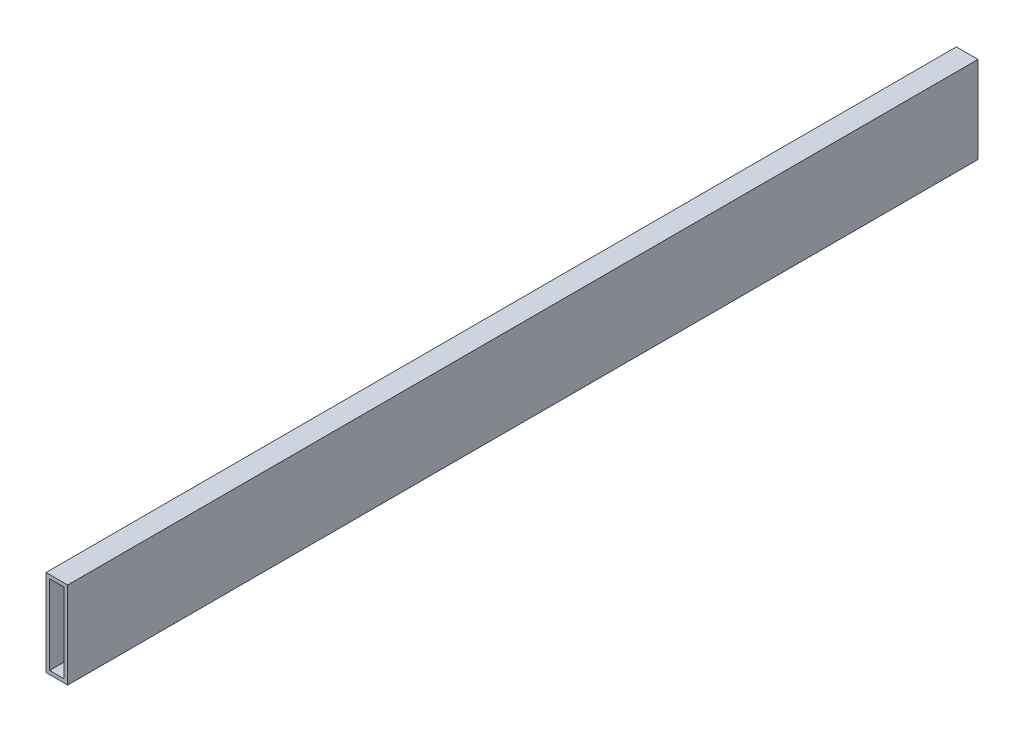
ISO-10303-21;
HEADER;
FILE_DESCRIPTION(('STEP AP214'),'2;1');
FILE_NAME('part.step','',(''),(''),'','','');
FILE_SCHEMA(('AUTOMOTIVE_DESIGN { 1 0 10303 214 1 1 1 1 }'));
ENDSEC;
DATA;
#1=APPLICATION_CONTEXT('core data for automotive mechanical design processes');
#2=APPLICATION_PROTOCOL_DEFINITION('international standard','automotive_design',2000,#1);
#3=PRODUCT_CONTEXT('',#1,'mechanical');
#4=PRODUCT('Part','Part','',(#3));
#5=PRODUCT_RELATED_PRODUCT_CATEGORY('part','',(#4));
#6=PRODUCT_DEFINITION_FORMATION('','',#4);
#7=PRODUCT_DEFINITION_CONTEXT('part definition',#1,'design');
#8=PRODUCT_DEFINITION('design','',#6,#7);
#9=PRODUCT_DEFINITION_SHAPE('','',#8);
#10=(LENGTH_UNIT() NAMED_UNIT(*) SI_UNIT(.MILLI.,.METRE.));
#11=(NAMED_UNIT(*) PLANE_ANGLE_UNIT() SI_UNIT($,.RADIAN.));
#12=(NAMED_UNIT(*) SI_UNIT($,.STERADIAN.) SOLID_ANGLE_UNIT());
#13=UNCERTAINTY_MEASURE_WITH_UNIT(LENGTH_MEASURE(1.E-05),#10,'distance_accuracy_value','');
#14=(GEOMETRIC_REPRESENTATION_CONTEXT(3) GLOBAL_UNCERTAINTY_ASSIGNED_CONTEXT((#13)) GLOBAL_UNIT_ASSIGNED_CONTEXT((#10,
#11,#12)) REPRESENTATION_CONTEXT('',''));
#15=CARTESIAN_POINT('',(0.,0.,0.));
#16=DIRECTION('',(0.,0.,1.));
#17=DIRECTION('',(1.,0.,0.));
#18=AXIS2_PLACEMENT_3D('',#15,#16,#17);
#19=CARTESIAN_POINT('',(0.,0.,800.1));
#20=DIRECTION('',(0.,0.,1.));
#21=DIRECTION('',(1.,0.,0.));
#22=AXIS2_PLACEMENT_3D('',#19,#20,#21);
#23=PLANE('',#22);
#24=DIRECTION('',(0.,1.,0.));
#25=VECTOR('',#24,1.);
#26=CARTESIAN_POINT('',(9.525,-38.1,800.1));
#27=LINE('',#26,#25);
#28=CARTESIAN_POINT('',(9.525,-38.1,800.1));
#29=VERTEX_POINT('',#28);
#30=CARTESIAN_POINT('',(9.525,38.1,800.1));
#31=VERTEX_POINT('',#30);
#32=EDGE_CURVE('E181',#29,#31,#27,.T.);
#33=ORIENTED_EDGE('',*,*,#32,.T.);
#34=DIRECTION('',(-1.,0.,0.));
#35=VECTOR('',#34,1.);
#36=CARTESIAN_POINT('',(-9.525,38.1,800.1));
#37=LINE('',#36,#35);
#38=CARTESIAN_POINT('',(-9.525,38.1,800.1));
#39=VERTEX_POINT('',#38);
#40=EDGE_CURVE('E185',#31,#39,#37,.T.);
#41=ORIENTED_EDGE('',*,*,#40,.T.);
#42=DIRECTION('',(0.,-1.,0.));
#43=VECTOR('',#42,1.);
#44=CARTESIAN_POINT('',(-9.525,-38.1,800.1));
#45=LINE('',#44,#43);
#46=CARTESIAN_POINT('',(-9.525,-38.1,800.1));
#47=VERTEX_POINT('',#46);
#48=EDGE_CURVE('E188',#39,#47,#45,.T.);
#49=ORIENTED_EDGE('',*,*,#48,.T.);
#50=DIRECTION('',(1.,0.,0.));
#51=VECTOR('',#50,1.);
#52=CARTESIAN_POINT('',(-9.525,-38.1,800.1));
#53=LINE('',#52,#51);
#54=EDGE_CURVE('E191',#47,#29,#53,.T.);
#55=ORIENTED_EDGE('',*,*,#54,.T.);
#56=EDGE_LOOP('',(#33,#41,#49,#55));
#57=FACE_BOUND('',#56,.T.);
#58=DIRECTION('',(-1.,0.,0.));
#59=VECTOR('',#58,1.);
#60=CARTESIAN_POINT('',(0.,34.925,800.1));
#61=LINE('',#60,#59);
#62=CARTESIAN_POINT('',(6.35,34.925,800.1));
#63=VERTEX_POINT('',#62);
#64=CARTESIAN_POINT('',(-6.35,34.925,800.1));
#65=VERTEX_POINT('',#64);
#66=EDGE_CURVE('E144',#63,#65,#61,.T.);
#67=ORIENTED_EDGE('',*,*,#66,.F.);
#68=DIRECTION('',(0.,1.,0.));
#69=VECTOR('',#68,1.);
#70=CARTESIAN_POINT('',(6.35,0.,800.1));
#71=LINE('',#70,#69);
#72=CARTESIAN_POINT('',(6.35,-34.925,800.1));
#73=VERTEX_POINT('',#72);
#74=EDGE_CURVE('E135',#73,#63,#71,.T.);
#75=ORIENTED_EDGE('',*,*,#74,.F.);
#76=DIRECTION('',(1.,0.,0.));
#77=VECTOR('',#76,1.);
#78=CARTESIAN_POINT('',(0.,-34.925,800.1));
#79=LINE('',#78,#77);
#80=CARTESIAN_POINT('',(-6.35,-34.925,800.1));
#81=VERTEX_POINT('',#80);
#82=EDGE_CURVE('E162',#81,#73,#79,.T.);
#83=ORIENTED_EDGE('',*,*,#82,.F.);
#84=DIRECTION('',(0.,-1.,0.));
#85=VECTOR('',#84,1.);
#86=CARTESIAN_POINT('',(-6.35,0.,800.1));
#87=LINE('',#86,#85);
#88=EDGE_CURVE('E157',#65,#81,#87,.T.);
#89=ORIENTED_EDGE('',*,*,#88,.F.);
#90=EDGE_LOOP('',(#67,#75,#83,#89));
#91=FACE_BOUND('',#90,.T.);
#92=ADVANCED_FACE('F63',(#57,#91),#23,.T.);
#93=CARTESIAN_POINT('',(0.,0.,0.));
#94=DIRECTION('',(0.,0.,1.));
#95=DIRECTION('',(1.,0.,0.));
#96=AXIS2_PLACEMENT_3D('',#93,#94,#95);
#97=PLANE('',#96);
#98=DIRECTION('',(0.,1.,0.));
#99=VECTOR('',#98,1.);
#100=CARTESIAN_POINT('',(9.525,-38.1,0.));
#101=LINE('',#100,#99);
#102=CARTESIAN_POINT('',(9.525,-38.1,0.));
#103=VERTEX_POINT('',#102);
#104=CARTESIAN_POINT('',(9.525,38.1,0.));
#105=VERTEX_POINT('',#104);
#106=EDGE_CURVE('E153',#103,#105,#101,.T.);
#107=ORIENTED_EDGE('',*,*,#106,.F.);
#108=DIRECTION('',(1.,0.,0.));
#109=VECTOR('',#108,1.);
#110=CARTESIAN_POINT('',(-9.525,-38.1,0.));
#111=LINE('',#110,#109);
#112=CARTESIAN_POINT('',(-9.525,-38.1,0.));
#113=VERTEX_POINT('',#112);
#114=EDGE_CURVE('E186',#113,#103,#111,.T.);
#115=ORIENTED_EDGE('',*,*,#114,.F.);
#116=DIRECTION('',(0.,-1.,0.));
#117=VECTOR('',#116,1.);
#118=CARTESIAN_POINT('',(-9.525,-38.1,0.));
#119=LINE('',#118,#117);
#120=CARTESIAN_POINT('',(-9.525,38.1,0.));
#121=VERTEX_POINT('',#120);
#122=EDGE_CURVE('E199',#121,#113,#119,.T.);
#123=ORIENTED_EDGE('',*,*,#122,.F.);
#124=DIRECTION('',(-1.,0.,0.));
#125=VECTOR('',#124,1.);
#126=CARTESIAN_POINT('',(-9.525,38.1,0.));
#127=LINE('',#126,#125);
#128=EDGE_CURVE('E197',#105,#121,#127,.T.);
#129=ORIENTED_EDGE('',*,*,#128,.F.);
#130=EDGE_LOOP('',(#107,#115,#123,#129));
#131=FACE_BOUND('',#130,.T.);
#132=DIRECTION('',(0.,1.,0.));
#133=VECTOR('',#132,1.);
#134=CARTESIAN_POINT('',(6.35,0.,0.));
#135=LINE('',#134,#133);
#136=CARTESIAN_POINT('',(6.35,-34.925,0.));
#137=VERTEX_POINT('',#136);
#138=CARTESIAN_POINT('',(6.35,34.925,0.));
#139=VERTEX_POINT('',#138);
#140=EDGE_CURVE('E90',#137,#139,#135,.T.);
#141=ORIENTED_EDGE('',*,*,#140,.T.);
#142=DIRECTION('',(-1.,0.,0.));
#143=VECTOR('',#142,1.);
#144=CARTESIAN_POINT('',(0.,34.925,0.));
#145=LINE('',#144,#143);
#146=CARTESIAN_POINT('',(-6.35,34.925,0.));
#147=VERTEX_POINT('',#146);
#148=EDGE_CURVE('E151',#139,#147,#145,.T.);
#149=ORIENTED_EDGE('',*,*,#148,.T.);
#150=DIRECTION('',(0.,-1.,0.));
#151=VECTOR('',#150,1.);
#152=CARTESIAN_POINT('',(-6.35,0.,0.));
#153=LINE('',#152,#151);
#154=CARTESIAN_POINT('',(-6.35,-34.925,0.));
#155=VERTEX_POINT('',#154);
#156=EDGE_CURVE('E169',#147,#155,#153,.T.);
#157=ORIENTED_EDGE('',*,*,#156,.T.);
#158=DIRECTION('',(1.,0.,0.));
#159=VECTOR('',#158,1.);
#160=CARTESIAN_POINT('',(0.,-34.925,0.));
#161=LINE('',#160,#159);
#162=EDGE_CURVE('E145',#155,#137,#161,.T.);
#163=ORIENTED_EDGE('',*,*,#162,.T.);
#164=EDGE_LOOP('',(#141,#149,#157,#163));
#165=FACE_BOUND('',#164,.T.);
#166=ADVANCED_FACE('F221',(#131,#165),#97,.F.);
#167=CARTESIAN_POINT('',(9.525,-38.1,800.1));
#168=DIRECTION('',(-1.,0.,0.));
#169=DIRECTION('',(0.,0.,1.));
#170=AXIS2_PLACEMENT_3D('',#167,#168,#169);
#171=PLANE('',#170);
#172=ORIENTED_EDGE('',*,*,#106,.T.);
#173=DIRECTION('',(0.,0.,-1.));
#174=VECTOR('',#173,1.);
#175=CARTESIAN_POINT('',(9.525,38.1,800.1));
#176=LINE('',#175,#174);
#177=EDGE_CURVE('E12',#31,#105,#176,.T.);
#178=ORIENTED_EDGE('',*,*,#177,.F.);
#179=ORIENTED_EDGE('',*,*,#32,.F.);
#180=DIRECTION('',(0.,0.,-1.));
#181=VECTOR('',#180,1.);
#182=CARTESIAN_POINT('',(9.525,-38.1,800.1));
#183=LINE('',#182,#181);
#184=EDGE_CURVE('E193',#29,#103,#183,.T.);
#185=ORIENTED_EDGE('',*,*,#184,.T.);
#186=EDGE_LOOP('',(#172,#178,#179,#185));
#187=FACE_BOUND('',#186,.T.);
#188=ADVANCED_FACE('F65',(#187),#171,.F.);
#189=CARTESIAN_POINT('',(-9.525,38.1,800.1));
#190=DIRECTION('',(0.,-1.,0.));
#191=DIRECTION('',(0.,0.,-1.));
#192=AXIS2_PLACEMENT_3D('',#189,#190,#191);
#193=PLANE('',#192);
#194=ORIENTED_EDGE('',*,*,#128,.T.);
#195=DIRECTION('',(0.,0.,-1.));
#196=VECTOR('',#195,1.);
#197=CARTESIAN_POINT('',(-9.525,38.1,800.1));
#198=LINE('',#197,#196);
#199=EDGE_CURVE('E72',#39,#121,#198,.T.);
#200=ORIENTED_EDGE('',*,*,#199,.F.);
#201=ORIENTED_EDGE('',*,*,#40,.F.);
#202=ORIENTED_EDGE('',*,*,#177,.T.);
#203=EDGE_LOOP('',(#194,#200,#201,#202));
#204=FACE_BOUND('',#203,.T.);
#205=ADVANCED_FACE('F231',(#204),#193,.F.);
#206=CARTESIAN_POINT('',(-9.525,-38.1,800.1));
#207=DIRECTION('',(1.,0.,0.));
#208=DIRECTION('',(0.,0.,-1.));
#209=AXIS2_PLACEMENT_3D('',#206,#207,#208);
#210=PLANE('',#209);
#211=ORIENTED_EDGE('',*,*,#122,.T.);
#212=DIRECTION('',(0.,0.,-1.));
#213=VECTOR('',#212,1.);
#214=CARTESIAN_POINT('',(-9.525,-38.1,800.1));
#215=LINE('',#214,#213);
#216=EDGE_CURVE('E206',#47,#113,#215,.T.);
#217=ORIENTED_EDGE('',*,*,#216,.F.);
#218=ORIENTED_EDGE('',*,*,#48,.F.);
#219=ORIENTED_EDGE('',*,*,#199,.T.);
#220=EDGE_LOOP('',(#211,#217,#218,#219));
#221=FACE_BOUND('',#220,.T.);
#222=ADVANCED_FACE('F215',(#221),#210,.F.);
#223=CARTESIAN_POINT('',(-9.525,-38.1,800.1));
#224=DIRECTION('',(0.,1.,0.));
#225=DIRECTION('',(0.,0.,1.));
#226=AXIS2_PLACEMENT_3D('',#223,#224,#225);
#227=PLANE('',#226);
#228=ORIENTED_EDGE('',*,*,#114,.T.);
#229=ORIENTED_EDGE('',*,*,#184,.F.);
#230=ORIENTED_EDGE('',*,*,#54,.F.);
#231=ORIENTED_EDGE('',*,*,#216,.T.);
#232=EDGE_LOOP('',(#228,#229,#230,#231));
#233=FACE_BOUND('',#232,.T.);
#234=ADVANCED_FACE('F225',(#233),#227,.F.);
#235=CARTESIAN_POINT('',(6.35,0.,800.1));
#236=DIRECTION('',(-1.,0.,0.));
#237=DIRECTION('',(0.,0.,1.));
#238=AXIS2_PLACEMENT_3D('',#235,#236,#237);
#239=PLANE('',#238);
#240=ORIENTED_EDGE('',*,*,#140,.F.);
#241=DIRECTION('',(0.,0.,-1.));
#242=VECTOR('',#241,1.);
#243=CARTESIAN_POINT('',(6.35,-34.925,800.1));
#244=LINE('',#243,#242);
#245=EDGE_CURVE('E139',#73,#137,#244,.T.);
#246=ORIENTED_EDGE('',*,*,#245,.F.);
#247=ORIENTED_EDGE('',*,*,#74,.T.);
#248=DIRECTION('',(0.,0.,-1.));
#249=VECTOR('',#248,1.);
#250=CARTESIAN_POINT('',(6.35,34.925,800.1));
#251=LINE('',#250,#249);
#252=EDGE_CURVE('E138',#63,#139,#251,.T.);
#253=ORIENTED_EDGE('',*,*,#252,.T.);
#254=EDGE_LOOP('',(#240,#246,#247,#253));
#255=FACE_BOUND('',#254,.T.);
#256=ADVANCED_FACE('F137',(#255),#239,.T.);
#257=CARTESIAN_POINT('',(0.,34.925,800.1));
#258=DIRECTION('',(0.,-1.,0.));
#259=DIRECTION('',(0.,0.,-1.));
#260=AXIS2_PLACEMENT_3D('',#257,#258,#259);
#261=PLANE('',#260);
#262=ORIENTED_EDGE('',*,*,#148,.F.);
#263=ORIENTED_EDGE('',*,*,#252,.F.);
#264=ORIENTED_EDGE('',*,*,#66,.T.);
#265=DIRECTION('',(0.,0.,-1.));
#266=VECTOR('',#265,1.);
#267=CARTESIAN_POINT('',(-6.35,34.925,800.1));
#268=LINE('',#267,#266);
#269=EDGE_CURVE('E154',#65,#147,#268,.T.);
#270=ORIENTED_EDGE('',*,*,#269,.T.);
#271=EDGE_LOOP('',(#262,#263,#264,#270));
#272=FACE_BOUND('',#271,.T.);
#273=ADVANCED_FACE('F148',(#272),#261,.T.);
#274=CARTESIAN_POINT('',(-6.35,0.,800.1));
#275=DIRECTION('',(1.,0.,0.));
#276=DIRECTION('',(0.,0.,-1.));
#277=AXIS2_PLACEMENT_3D('',#274,#275,#276);
#278=PLANE('',#277);
#279=ORIENTED_EDGE('',*,*,#156,.F.);
#280=ORIENTED_EDGE('',*,*,#269,.F.);
#281=ORIENTED_EDGE('',*,*,#88,.T.);
#282=DIRECTION('',(0.,0.,-1.));
#283=VECTOR('',#282,1.);
#284=CARTESIAN_POINT('',(-6.35,-34.925,800.1));
#285=LINE('',#284,#283);
#286=EDGE_CURVE('E79',#81,#155,#285,.T.);
#287=ORIENTED_EDGE('',*,*,#286,.T.);
#288=EDGE_LOOP('',(#279,#280,#281,#287));
#289=FACE_BOUND('',#288,.T.);
#290=ADVANCED_FACE('F254',(#289),#278,.T.);
#291=CARTESIAN_POINT('',(0.,-34.925,800.1));
#292=DIRECTION('',(0.,1.,0.));
#293=DIRECTION('',(0.,0.,1.));
#294=AXIS2_PLACEMENT_3D('',#291,#292,#293);
#295=PLANE('',#294);
#296=ORIENTED_EDGE('',*,*,#162,.F.);
#297=ORIENTED_EDGE('',*,*,#286,.F.);
#298=ORIENTED_EDGE('',*,*,#82,.T.);
#299=ORIENTED_EDGE('',*,*,#245,.T.);
#300=EDGE_LOOP('',(#296,#297,#298,#299));
#301=FACE_BOUND('',#300,.T.);
#302=ADVANCED_FACE('F258',(#301),#295,.T.);
#303=CLOSED_SHELL('',(#92,#166,#188,#205,#222,#234,#256,#273,#290,#302));
#304=MANIFOLD_SOLID_BREP('B2',#303);
#305=ADVANCED_BREP_SHAPE_REPRESENTATION('',(#18,#304),#14);
#306=SHAPE_DEFINITION_REPRESENTATION(#9,#305);
ENDSEC;
END-ISO-10303-21;
